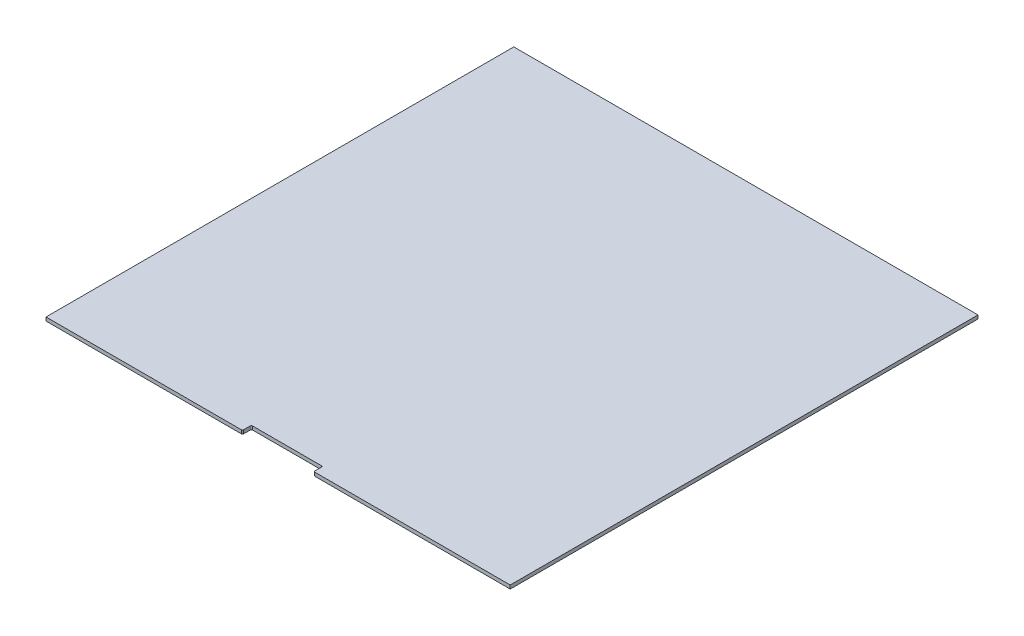
ISO-10303-21;
HEADER;
FILE_DESCRIPTION(('STEP AP214'),'2;1');
FILE_NAME('part.step','',(''),(''),'','','');
FILE_SCHEMA(('AUTOMOTIVE_DESIGN { 1 0 10303 214 1 1 1 1 }'));
ENDSEC;
DATA;
#1=APPLICATION_CONTEXT('core data for automotive mechanical design processes');
#2=APPLICATION_PROTOCOL_DEFINITION('international standard','automotive_design',2000,#1);
#3=PRODUCT_CONTEXT('',#1,'mechanical');
#4=PRODUCT('Part','Part','',(#3));
#5=PRODUCT_RELATED_PRODUCT_CATEGORY('part','',(#4));
#6=PRODUCT_DEFINITION_FORMATION('','',#4);
#7=PRODUCT_DEFINITION_CONTEXT('part definition',#1,'design');
#8=PRODUCT_DEFINITION('design','',#6,#7);
#9=PRODUCT_DEFINITION_SHAPE('','',#8);
#10=(LENGTH_UNIT() NAMED_UNIT(*) SI_UNIT(.MILLI.,.METRE.));
#11=(NAMED_UNIT(*) PLANE_ANGLE_UNIT() SI_UNIT($,.RADIAN.));
#12=(NAMED_UNIT(*) SI_UNIT($,.STERADIAN.) SOLID_ANGLE_UNIT());
#13=UNCERTAINTY_MEASURE_WITH_UNIT(LENGTH_MEASURE(1.E-05),#10,'distance_accuracy_value','');
#14=(GEOMETRIC_REPRESENTATION_CONTEXT(3) GLOBAL_UNCERTAINTY_ASSIGNED_CONTEXT((#13)) GLOBAL_UNIT_ASSIGNED_CONTEXT((#10,
#11,#12)) REPRESENTATION_CONTEXT('',''));
#15=CARTESIAN_POINT('',(0.,0.,0.));
#16=DIRECTION('',(0.,0.,1.));
#17=DIRECTION('',(1.,0.,0.));
#18=AXIS2_PLACEMENT_3D('',#15,#16,#17);
#19=CARTESIAN_POINT('',(-195.5,3.,197.));
#20=DIRECTION('',(0.,0.,-1.));
#21=DIRECTION('',(-1.,0.,0.));
#22=AXIS2_PLACEMENT_3D('',#19,#20,#21);
#23=PLANE('',#22);
#24=DIRECTION('',(1.,0.,0.));
#25=VECTOR('',#24,1.);
#26=CARTESIAN_POINT('',(-195.5,0.,197.));
#27=LINE('',#26,#25);
#28=CARTESIAN_POINT('',(-195.5,0.,197.));
#29=VERTEX_POINT('',#28);
#30=CARTESIAN_POINT('',(-31.,0.,197.));
#31=VERTEX_POINT('',#30);
#32=EDGE_CURVE('E153',#29,#31,#27,.T.);
#33=ORIENTED_EDGE('',*,*,#32,.T.);
#34=DIRECTION('',(0.,1.,0.));
#35=VECTOR('',#34,1.);
#36=CARTESIAN_POINT('',(-31.,3.,197.));
#37=LINE('',#36,#35);
#38=CARTESIAN_POINT('',(-31.,3.,197.));
#39=VERTEX_POINT('',#38);
#40=EDGE_CURVE('E199',#31,#39,#37,.T.);
#41=ORIENTED_EDGE('',*,*,#40,.T.);
#42=DIRECTION('',(1.,0.,0.));
#43=VECTOR('',#42,1.);
#44=CARTESIAN_POINT('',(-195.5,3.,197.));
#45=LINE('',#44,#43);
#46=CARTESIAN_POINT('',(-195.5,3.,197.));
#47=VERTEX_POINT('',#46);
#48=EDGE_CURVE('E248',#47,#39,#45,.T.);
#49=ORIENTED_EDGE('',*,*,#48,.F.);
#50=DIRECTION('',(0.,-1.,0.));
#51=VECTOR('',#50,1.);
#52=CARTESIAN_POINT('',(-195.5,3.,197.));
#53=LINE('',#52,#51);
#54=EDGE_CURVE('E165',#47,#29,#53,.T.);
#55=ORIENTED_EDGE('',*,*,#54,.T.);
#56=EDGE_LOOP('',(#33,#41,#49,#55));
#57=FACE_BOUND('',#56,.T.);
#58=ADVANCED_FACE('F38',(#57),#23,.F.);
#59=CARTESIAN_POINT('',(195.5,3.,-197.));
#60=DIRECTION('',(-1.,0.,0.));
#61=DIRECTION('',(0.,0.,1.));
#62=AXIS2_PLACEMENT_3D('',#59,#60,#61);
#63=PLANE('',#62);
#64=DIRECTION('',(0.,0.,-1.));
#65=VECTOR('',#64,1.);
#66=CARTESIAN_POINT('',(195.5,0.,-197.));
#67=LINE('',#66,#65);
#68=CARTESIAN_POINT('',(195.5,0.,197.));
#69=VERTEX_POINT('',#68);
#70=CARTESIAN_POINT('',(195.5,0.,-197.));
#71=VERTEX_POINT('',#70);
#72=EDGE_CURVE('E157',#69,#71,#67,.T.);
#73=ORIENTED_EDGE('',*,*,#72,.T.);
#74=DIRECTION('',(0.,-1.,0.));
#75=VECTOR('',#74,1.);
#76=CARTESIAN_POINT('',(195.5,3.,-197.));
#77=LINE('',#76,#75);
#78=CARTESIAN_POINT('',(195.5,3.,-197.));
#79=VERTEX_POINT('',#78);
#80=EDGE_CURVE('E134',#79,#71,#77,.T.);
#81=ORIENTED_EDGE('',*,*,#80,.F.);
#82=DIRECTION('',(0.,0.,-1.));
#83=VECTOR('',#82,1.);
#84=CARTESIAN_POINT('',(195.5,3.,-197.));
#85=LINE('',#84,#83);
#86=CARTESIAN_POINT('',(195.5,3.,197.));
#87=VERTEX_POINT('',#86);
#88=EDGE_CURVE('E142',#87,#79,#85,.T.);
#89=ORIENTED_EDGE('',*,*,#88,.F.);
#90=DIRECTION('',(0.,-1.,0.));
#91=VECTOR('',#90,1.);
#92=CARTESIAN_POINT('',(195.5,3.,197.));
#93=LINE('',#92,#91);
#94=EDGE_CURVE('E252',#87,#69,#93,.T.);
#95=ORIENTED_EDGE('',*,*,#94,.T.);
#96=EDGE_LOOP('',(#73,#81,#89,#95));
#97=FACE_BOUND('',#96,.T.);
#98=ADVANCED_FACE('F155',(#97),#63,.F.);
#99=CARTESIAN_POINT('',(-195.5,3.,-197.));
#100=DIRECTION('',(0.,0.,1.));
#101=DIRECTION('',(1.,0.,0.));
#102=AXIS2_PLACEMENT_3D('',#99,#100,#101);
#103=PLANE('',#102);
#104=DIRECTION('',(-1.,0.,0.));
#105=VECTOR('',#104,1.);
#106=CARTESIAN_POINT('',(-195.5,0.,-197.));
#107=LINE('',#106,#105);
#108=CARTESIAN_POINT('',(-195.5,0.,-197.));
#109=VERTEX_POINT('',#108);
#110=EDGE_CURVE('E255',#71,#109,#107,.T.);
#111=ORIENTED_EDGE('',*,*,#110,.T.);
#112=DIRECTION('',(0.,-1.,0.));
#113=VECTOR('',#112,1.);
#114=CARTESIAN_POINT('',(-195.5,3.,-197.));
#115=LINE('',#114,#113);
#116=CARTESIAN_POINT('',(-195.5,3.,-197.));
#117=VERTEX_POINT('',#116);
#118=EDGE_CURVE('E137',#117,#109,#115,.T.);
#119=ORIENTED_EDGE('',*,*,#118,.F.);
#120=DIRECTION('',(-1.,0.,0.));
#121=VECTOR('',#120,1.);
#122=CARTESIAN_POINT('',(-195.5,3.,-197.));
#123=LINE('',#122,#121);
#124=EDGE_CURVE('E130',#79,#117,#123,.T.);
#125=ORIENTED_EDGE('',*,*,#124,.F.);
#126=ORIENTED_EDGE('',*,*,#80,.T.);
#127=EDGE_LOOP('',(#111,#119,#125,#126));
#128=FACE_BOUND('',#127,.T.);
#129=ADVANCED_FACE('F132',(#128),#103,.F.);
#130=CARTESIAN_POINT('',(-195.5,3.,-197.));
#131=DIRECTION('',(1.,0.,0.));
#132=DIRECTION('',(0.,0.,-1.));
#133=AXIS2_PLACEMENT_3D('',#130,#131,#132);
#134=PLANE('',#133);
#135=DIRECTION('',(0.,0.,1.));
#136=VECTOR('',#135,1.);
#137=CARTESIAN_POINT('',(-195.5,0.,-197.));
#138=LINE('',#137,#136);
#139=EDGE_CURVE('E258',#109,#29,#138,.T.);
#140=ORIENTED_EDGE('',*,*,#139,.T.);
#141=ORIENTED_EDGE('',*,*,#54,.F.);
#142=DIRECTION('',(0.,0.,1.));
#143=VECTOR('',#142,1.);
#144=CARTESIAN_POINT('',(-195.5,3.,-197.));
#145=LINE('',#144,#143);
#146=EDGE_CURVE('E141',#117,#47,#145,.T.);
#147=ORIENTED_EDGE('',*,*,#146,.F.);
#148=ORIENTED_EDGE('',*,*,#118,.T.);
#149=EDGE_LOOP('',(#140,#141,#147,#148));
#150=FACE_BOUND('',#149,.T.);
#151=ADVANCED_FACE('F273',(#150),#134,.F.);
#152=CARTESIAN_POINT('',(31.,3.,197.));
#153=VERTEX_POINT('',#152);
#154=EDGE_CURVE('E148',#153,#87,#45,.T.);
#155=ORIENTED_EDGE('',*,*,#154,.F.);
#156=DIRECTION('',(0.,1.,0.));
#157=VECTOR('',#156,1.);
#158=CARTESIAN_POINT('',(31.,3.,197.));
#159=LINE('',#158,#157);
#160=CARTESIAN_POINT('',(31.,0.,197.));
#161=VERTEX_POINT('',#160);
#162=EDGE_CURVE('E178',#153,#161,#159,.F.);
#163=ORIENTED_EDGE('',*,*,#162,.T.);
#164=EDGE_CURVE('E261',#161,#69,#27,.T.);
#165=ORIENTED_EDGE('',*,*,#164,.T.);
#166=ORIENTED_EDGE('',*,*,#94,.F.);
#167=EDGE_LOOP('',(#155,#163,#165,#166));
#168=FACE_BOUND('',#167,.T.);
#169=ADVANCED_FACE('F282',(#168),#23,.F.);
#170=CARTESIAN_POINT('',(0.,3.,0.));
#171=DIRECTION('',(0.,1.,0.));
#172=DIRECTION('',(0.,0.,1.));
#173=AXIS2_PLACEMENT_3D('',#170,#171,#172);
#174=PLANE('',#173);
#175=DIRECTION('',(0.,0.,-1.));
#176=VECTOR('',#175,1.);
#177=CARTESIAN_POINT('',(30.,3.,197.));
#178=LINE('',#177,#176);
#179=CARTESIAN_POINT('',(30.,3.,196.));
#180=VERTEX_POINT('',#179);
#181=CARTESIAN_POINT('',(30.,3.,190.5));
#182=VERTEX_POINT('',#181);
#183=EDGE_CURVE('E224',#180,#182,#178,.T.);
#184=ORIENTED_EDGE('',*,*,#183,.F.);
#185=CARTESIAN_POINT('',(31.,3.,196.));
#186=DIRECTION('',(0.,1.,0.));
#187=DIRECTION('',(0.,0.,1.));
#188=AXIS2_PLACEMENT_3D('',#185,#186,#187);
#189=CIRCLE('',#188,1.);
#190=EDGE_CURVE('E175',#180,#153,#189,.T.);
#191=ORIENTED_EDGE('',*,*,#190,.T.);
#192=ORIENTED_EDGE('',*,*,#154,.T.);
#193=ORIENTED_EDGE('',*,*,#88,.T.);
#194=ORIENTED_EDGE('',*,*,#124,.T.);
#195=ORIENTED_EDGE('',*,*,#146,.T.);
#196=ORIENTED_EDGE('',*,*,#48,.T.);
#197=CARTESIAN_POINT('',(-31.,3.,196.));
#198=DIRECTION('',(0.,1.,0.));
#199=DIRECTION('',(0.,0.,1.));
#200=AXIS2_PLACEMENT_3D('',#197,#198,#199);
#201=CIRCLE('',#200,1.);
#202=CARTESIAN_POINT('',(-30.,3.,196.));
#203=VERTEX_POINT('',#202);
#204=EDGE_CURVE('E172',#39,#203,#201,.T.);
#205=ORIENTED_EDGE('',*,*,#204,.T.);
#206=DIRECTION('',(0.,0.,1.));
#207=VECTOR('',#206,1.);
#208=CARTESIAN_POINT('',(-30.,3.,197.));
#209=LINE('',#208,#207);
#210=CARTESIAN_POINT('',(-30.,3.,190.5));
#211=VERTEX_POINT('',#210);
#212=EDGE_CURVE('E213',#211,#203,#209,.T.);
#213=ORIENTED_EDGE('',*,*,#212,.F.);
#214=CARTESIAN_POINT('',(-29.,3.,190.5));
#215=DIRECTION('',(0.,1.,0.));
#216=DIRECTION('',(0.,0.,1.));
#217=AXIS2_PLACEMENT_3D('',#214,#215,#216);
#218=CIRCLE('',#217,1.);
#219=CARTESIAN_POINT('',(-29.,3.,189.5));
#220=VERTEX_POINT('',#219);
#221=EDGE_CURVE('E47',#211,#220,#218,.F.);
#222=ORIENTED_EDGE('',*,*,#221,.T.);
#223=DIRECTION('',(-1.,0.,0.));
#224=VECTOR('',#223,1.);
#225=CARTESIAN_POINT('',(-30.,3.,189.5));
#226=LINE('',#225,#224);
#227=CARTESIAN_POINT('',(29.,3.,189.5));
#228=VERTEX_POINT('',#227);
#229=EDGE_CURVE('E212',#228,#220,#226,.T.);
#230=ORIENTED_EDGE('',*,*,#229,.F.);
#231=CARTESIAN_POINT('',(29.,3.,190.5));
#232=DIRECTION('',(0.,1.,0.));
#233=DIRECTION('',(0.,0.,1.));
#234=AXIS2_PLACEMENT_3D('',#231,#232,#233);
#235=CIRCLE('',#234,1.);
#236=EDGE_CURVE('E203',#228,#182,#235,.F.);
#237=ORIENTED_EDGE('',*,*,#236,.T.);
#238=EDGE_LOOP('',(#184,#191,#192,#193,#194,#195,#196,#205,#213,#222,#230,#237));
#239=FACE_BOUND('',#238,.T.);
#240=ADVANCED_FACE('F146',(#239),#174,.T.);
#241=CARTESIAN_POINT('',(0.,0.,0.));
#242=DIRECTION('',(0.,1.,0.));
#243=DIRECTION('',(0.,0.,1.));
#244=AXIS2_PLACEMENT_3D('',#241,#242,#243);
#245=PLANE('',#244);
#246=ORIENTED_EDGE('',*,*,#164,.F.);
#247=CARTESIAN_POINT('',(31.,0.,196.));
#248=DIRECTION('',(0.,1.,0.));
#249=DIRECTION('',(0.,0.,1.));
#250=AXIS2_PLACEMENT_3D('',#247,#248,#249);
#251=CIRCLE('',#250,1.);
#252=CARTESIAN_POINT('',(30.,0.,196.));
#253=VERTEX_POINT('',#252);
#254=EDGE_CURVE('E183',#161,#253,#251,.F.);
#255=ORIENTED_EDGE('',*,*,#254,.T.);
#256=DIRECTION('',(0.,0.,-1.));
#257=VECTOR('',#256,1.);
#258=CARTESIAN_POINT('',(30.,0.,197.));
#259=LINE('',#258,#257);
#260=CARTESIAN_POINT('',(30.,0.,190.5));
#261=VERTEX_POINT('',#260);
#262=EDGE_CURVE('E233',#253,#261,#259,.T.);
#263=ORIENTED_EDGE('',*,*,#262,.T.);
#264=CARTESIAN_POINT('',(29.,0.,190.5));
#265=DIRECTION('',(0.,1.,0.));
#266=DIRECTION('',(0.,0.,1.));
#267=AXIS2_PLACEMENT_3D('',#264,#265,#266);
#268=CIRCLE('',#267,1.);
#269=CARTESIAN_POINT('',(29.,0.,189.5));
#270=VERTEX_POINT('',#269);
#271=EDGE_CURVE('E206',#261,#270,#268,.T.);
#272=ORIENTED_EDGE('',*,*,#271,.T.);
#273=DIRECTION('',(-1.,0.,0.));
#274=VECTOR('',#273,1.);
#275=CARTESIAN_POINT('',(-30.,0.,189.5));
#276=LINE('',#275,#274);
#277=CARTESIAN_POINT('',(-29.,0.,189.5));
#278=VERTEX_POINT('',#277);
#279=EDGE_CURVE('E230',#270,#278,#276,.T.);
#280=ORIENTED_EDGE('',*,*,#279,.T.);
#281=CARTESIAN_POINT('',(-29.,0.,190.5));
#282=DIRECTION('',(0.,1.,0.));
#283=DIRECTION('',(0.,0.,1.));
#284=AXIS2_PLACEMENT_3D('',#281,#282,#283);
#285=CIRCLE('',#284,1.);
#286=CARTESIAN_POINT('',(-30.,0.,190.5));
#287=VERTEX_POINT('',#286);
#288=EDGE_CURVE('E11',#278,#287,#285,.T.);
#289=ORIENTED_EDGE('',*,*,#288,.T.);
#290=DIRECTION('',(0.,0.,1.));
#291=VECTOR('',#290,1.);
#292=CARTESIAN_POINT('',(-30.,0.,197.));
#293=LINE('',#292,#291);
#294=CARTESIAN_POINT('',(-30.,0.,196.));
#295=VERTEX_POINT('',#294);
#296=EDGE_CURVE('E223',#287,#295,#293,.T.);
#297=ORIENTED_EDGE('',*,*,#296,.T.);
#298=CARTESIAN_POINT('',(-31.,0.,196.));
#299=DIRECTION('',(0.,1.,0.));
#300=DIRECTION('',(0.,0.,1.));
#301=AXIS2_PLACEMENT_3D('',#298,#299,#300);
#302=CIRCLE('',#301,1.);
#303=EDGE_CURVE('E54',#295,#31,#302,.F.);
#304=ORIENTED_EDGE('',*,*,#303,.T.);
#305=ORIENTED_EDGE('',*,*,#32,.F.);
#306=ORIENTED_EDGE('',*,*,#139,.F.);
#307=ORIENTED_EDGE('',*,*,#110,.F.);
#308=ORIENTED_EDGE('',*,*,#72,.F.);
#309=EDGE_LOOP('',(#246,#255,#263,#272,#280,#289,#297,#304,#305,#306,#307,#308));
#310=FACE_BOUND('',#309,.T.);
#311=ADVANCED_FACE('F229',(#310),#245,.F.);
#312=CARTESIAN_POINT('',(-30.,0.,197.));
#313=DIRECTION('',(-1.,0.,0.));
#314=DIRECTION('',(0.,0.,1.));
#315=AXIS2_PLACEMENT_3D('',#312,#313,#314);
#316=PLANE('',#315);
#317=ORIENTED_EDGE('',*,*,#296,.F.);
#318=DIRECTION('',(0.,1.,0.));
#319=VECTOR('',#318,1.);
#320=CARTESIAN_POINT('',(-30.,3.,190.5));
#321=LINE('',#320,#319);
#322=EDGE_CURVE('E195',#287,#211,#321,.T.);
#323=ORIENTED_EDGE('',*,*,#322,.T.);
#324=ORIENTED_EDGE('',*,*,#212,.T.);
#325=DIRECTION('',(0.,1.,0.));
#326=VECTOR('',#325,1.);
#327=CARTESIAN_POINT('',(-30.,0.,196.));
#328=LINE('',#327,#326);
#329=EDGE_CURVE('E62',#203,#295,#328,.F.);
#330=ORIENTED_EDGE('',*,*,#329,.T.);
#331=EDGE_LOOP('',(#317,#323,#324,#330));
#332=FACE_BOUND('',#331,.T.);
#333=ADVANCED_FACE('F231',(#332),#316,.F.);
#334=CARTESIAN_POINT('',(-30.,0.,189.5));
#335=DIRECTION('',(0.,0.,-1.));
#336=DIRECTION('',(-1.,0.,0.));
#337=AXIS2_PLACEMENT_3D('',#334,#335,#336);
#338=PLANE('',#337);
#339=ORIENTED_EDGE('',*,*,#279,.F.);
#340=DIRECTION('',(0.,1.,0.));
#341=VECTOR('',#340,1.);
#342=CARTESIAN_POINT('',(29.,3.,189.5));
#343=LINE('',#342,#341);
#344=EDGE_CURVE('E189',#270,#228,#343,.T.);
#345=ORIENTED_EDGE('',*,*,#344,.T.);
#346=ORIENTED_EDGE('',*,*,#229,.T.);
#347=DIRECTION('',(0.,1.,0.));
#348=VECTOR('',#347,1.);
#349=CARTESIAN_POINT('',(-29.,0.,189.5));
#350=LINE('',#349,#348);
#351=EDGE_CURVE('E186',#220,#278,#350,.F.);
#352=ORIENTED_EDGE('',*,*,#351,.T.);
#353=EDGE_LOOP('',(#339,#345,#346,#352));
#354=FACE_BOUND('',#353,.T.);
#355=ADVANCED_FACE('F219',(#354),#338,.F.);
#356=CARTESIAN_POINT('',(30.,0.,197.));
#357=DIRECTION('',(1.,0.,0.));
#358=DIRECTION('',(0.,0.,-1.));
#359=AXIS2_PLACEMENT_3D('',#356,#357,#358);
#360=PLANE('',#359);
#361=ORIENTED_EDGE('',*,*,#262,.F.);
#362=DIRECTION('',(0.,1.,0.));
#363=VECTOR('',#362,1.);
#364=CARTESIAN_POINT('',(30.,0.,196.));
#365=LINE('',#364,#363);
#366=EDGE_CURVE('E163',#253,#180,#365,.T.);
#367=ORIENTED_EDGE('',*,*,#366,.T.);
#368=ORIENTED_EDGE('',*,*,#183,.T.);
#369=DIRECTION('',(0.,1.,0.));
#370=VECTOR('',#369,1.);
#371=CARTESIAN_POINT('',(30.,0.,190.5));
#372=LINE('',#371,#370);
#373=EDGE_CURVE('E159',#182,#261,#372,.F.);
#374=ORIENTED_EDGE('',*,*,#373,.T.);
#375=EDGE_LOOP('',(#361,#367,#368,#374));
#376=FACE_BOUND('',#375,.T.);
#377=ADVANCED_FACE('F306',(#376),#360,.F.);
#378=CARTESIAN_POINT('',(31.,0.,196.));
#379=DIRECTION('',(0.,1.,0.));
#380=DIRECTION('',(0.,0.,1.));
#381=AXIS2_PLACEMENT_3D('',#378,#379,#380);
#382=CYLINDRICAL_SURFACE('',#381,1.);
#383=ORIENTED_EDGE('',*,*,#254,.F.);
#384=ORIENTED_EDGE('',*,*,#162,.F.);
#385=ORIENTED_EDGE('',*,*,#190,.F.);
#386=ORIENTED_EDGE('',*,*,#366,.F.);
#387=EDGE_LOOP('',(#383,#384,#385,#386));
#388=FACE_BOUND('',#387,.T.);
#389=ADVANCED_FACE('F301',(#388),#382,.T.);
#390=CARTESIAN_POINT('',(29.,0.,190.5));
#391=DIRECTION('',(0.,-1.,0.));
#392=DIRECTION('',(0.,0.,-1.));
#393=AXIS2_PLACEMENT_3D('',#390,#391,#392);
#394=CYLINDRICAL_SURFACE('',#393,1.);
#395=ORIENTED_EDGE('',*,*,#271,.F.);
#396=ORIENTED_EDGE('',*,*,#373,.F.);
#397=ORIENTED_EDGE('',*,*,#236,.F.);
#398=ORIENTED_EDGE('',*,*,#344,.F.);
#399=EDGE_LOOP('',(#395,#396,#397,#398));
#400=FACE_BOUND('',#399,.T.);
#401=ADVANCED_FACE('F279',(#400),#394,.F.);
#402=CARTESIAN_POINT('',(-29.,0.,190.5));
#403=DIRECTION('',(0.,-1.,0.));
#404=DIRECTION('',(0.,0.,-1.));
#405=AXIS2_PLACEMENT_3D('',#402,#403,#404);
#406=CYLINDRICAL_SURFACE('',#405,1.);
#407=ORIENTED_EDGE('',*,*,#288,.F.);
#408=ORIENTED_EDGE('',*,*,#351,.F.);
#409=ORIENTED_EDGE('',*,*,#221,.F.);
#410=ORIENTED_EDGE('',*,*,#322,.F.);
#411=EDGE_LOOP('',(#407,#408,#409,#410));
#412=FACE_BOUND('',#411,.T.);
#413=ADVANCED_FACE('F227',(#412),#406,.F.);
#414=CARTESIAN_POINT('',(-31.,3.,196.));
#415=DIRECTION('',(0.,1.,0.));
#416=DIRECTION('',(0.,0.,1.));
#417=AXIS2_PLACEMENT_3D('',#414,#415,#416);
#418=CYLINDRICAL_SURFACE('',#417,1.);
#419=ORIENTED_EDGE('',*,*,#303,.F.);
#420=ORIENTED_EDGE('',*,*,#329,.F.);
#421=ORIENTED_EDGE('',*,*,#204,.F.);
#422=ORIENTED_EDGE('',*,*,#40,.F.);
#423=EDGE_LOOP('',(#419,#420,#421,#422));
#424=FACE_BOUND('',#423,.T.);
#425=ADVANCED_FACE('F40',(#424),#418,.T.);
#426=CLOSED_SHELL('',(#58,#98,#129,#151,#169,#240,#311,#333,#355,#377,#389,#401,#413,#425));
#427=MANIFOLD_SOLID_BREP('B2',#426);
#428=ADVANCED_BREP_SHAPE_REPRESENTATION('',(#18,#427),#14);
#429=SHAPE_DEFINITION_REPRESENTATION(#9,#428);
ENDSEC;
END-ISO-10303-21;
